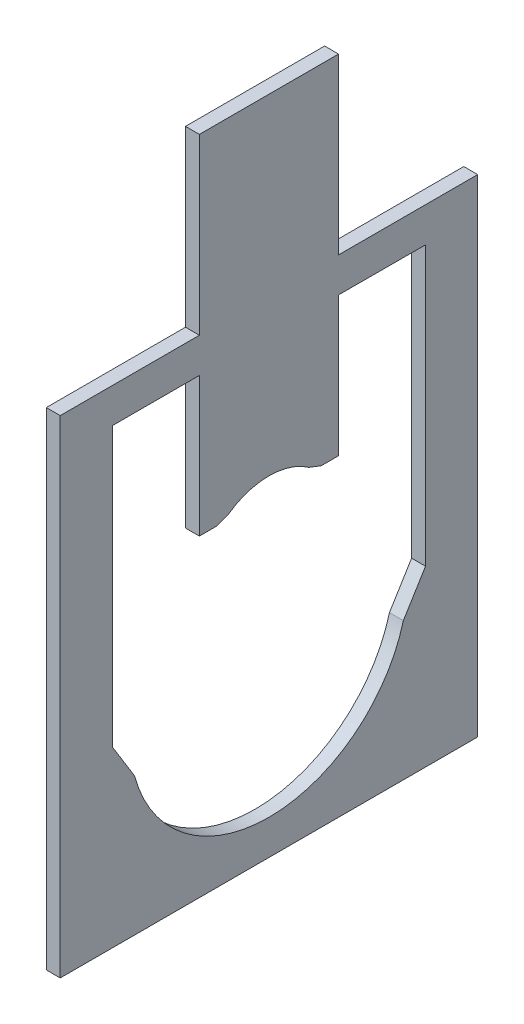
ISO-10303-21;
HEADER;
FILE_DESCRIPTION(('STEP AP214'),'2;1');
FILE_NAME('part.step','',(''),(''),'','','');
FILE_SCHEMA(('AUTOMOTIVE_DESIGN { 1 0 10303 214 1 1 1 1 }'));
ENDSEC;
DATA;
#1=APPLICATION_CONTEXT('core data for automotive mechanical design processes');
#2=APPLICATION_PROTOCOL_DEFINITION('international standard','automotive_design',2000,#1);
#3=PRODUCT_CONTEXT('',#1,'mechanical');
#4=PRODUCT('Part','Part','',(#3));
#5=PRODUCT_RELATED_PRODUCT_CATEGORY('part','',(#4));
#6=PRODUCT_DEFINITION_FORMATION('','',#4);
#7=PRODUCT_DEFINITION_CONTEXT('part definition',#1,'design');
#8=PRODUCT_DEFINITION('design','',#6,#7);
#9=PRODUCT_DEFINITION_SHAPE('','',#8);
#10=(LENGTH_UNIT() NAMED_UNIT(*) SI_UNIT(.MILLI.,.METRE.));
#11=(NAMED_UNIT(*) PLANE_ANGLE_UNIT() SI_UNIT($,.RADIAN.));
#12=(NAMED_UNIT(*) SI_UNIT($,.STERADIAN.) SOLID_ANGLE_UNIT());
#13=UNCERTAINTY_MEASURE_WITH_UNIT(LENGTH_MEASURE(1.E-05),#10,'distance_accuracy_value','');
#14=(GEOMETRIC_REPRESENTATION_CONTEXT(3) GLOBAL_UNCERTAINTY_ASSIGNED_CONTEXT((#13)) GLOBAL_UNIT_ASSIGNED_CONTEXT((#10,
#11,#12)) REPRESENTATION_CONTEXT('',''));
#15=CARTESIAN_POINT('',(0.,0.,0.));
#16=DIRECTION('',(0.,0.,1.));
#17=DIRECTION('',(1.,0.,0.));
#18=AXIS2_PLACEMENT_3D('',#15,#16,#17);
#19=CARTESIAN_POINT('',(2.,0.,20.));
#20=DIRECTION('',(0.,0.,-1.));
#21=DIRECTION('',(-1.,0.,0.));
#22=AXIS2_PLACEMENT_3D('',#19,#20,#21);
#23=PLANE('',#22);
#24=DIRECTION('',(0.,-1.,0.));
#25=VECTOR('',#24,1.);
#26=CARTESIAN_POINT('',(0.,0.,20.));
#27=LINE('',#26,#25);
#28=CARTESIAN_POINT('',(0.,25.,20.));
#29=VERTEX_POINT('',#28);
#30=CARTESIAN_POINT('',(0.,0.,20.));
#31=VERTEX_POINT('',#30);
#32=EDGE_CURVE('E307',#29,#31,#27,.T.);
#33=ORIENTED_EDGE('',*,*,#32,.T.);
#34=DIRECTION('',(-1.,0.,0.));
#35=VECTOR('',#34,1.);
#36=CARTESIAN_POINT('',(2.,0.,20.));
#37=LINE('',#36,#35);
#38=CARTESIAN_POINT('',(2.,0.,20.));
#39=VERTEX_POINT('',#38);
#40=EDGE_CURVE('E11',#39,#31,#37,.T.);
#41=ORIENTED_EDGE('',*,*,#40,.F.);
#42=DIRECTION('',(0.,-1.,0.));
#43=VECTOR('',#42,1.);
#44=CARTESIAN_POINT('',(2.,0.,20.));
#45=LINE('',#44,#43);
#46=CARTESIAN_POINT('',(2.,25.,20.));
#47=VERTEX_POINT('',#46);
#48=EDGE_CURVE('E243',#47,#39,#45,.T.);
#49=ORIENTED_EDGE('',*,*,#48,.F.);
#50=DIRECTION('',(-1.,0.,0.));
#51=VECTOR('',#50,1.);
#52=CARTESIAN_POINT('',(2.,25.,20.));
#53=LINE('',#52,#51);
#54=EDGE_CURVE('E54',#47,#29,#53,.T.);
#55=ORIENTED_EDGE('',*,*,#54,.T.);
#56=EDGE_LOOP('',(#33,#41,#49,#55));
#57=FACE_BOUND('',#56,.T.);
#58=ADVANCED_FACE('F35',(#57),#23,.F.);
#59=CARTESIAN_POINT('',(2.,0.,0.));
#60=DIRECTION('',(0.,1.,0.));
#61=DIRECTION('',(0.,0.,1.));
#62=AXIS2_PLACEMENT_3D('',#59,#60,#61);
#63=PLANE('',#62);
#64=DIRECTION('',(0.,0.,-1.));
#65=VECTOR('',#64,1.);
#66=CARTESIAN_POINT('',(0.,0.,0.));
#67=LINE('',#66,#65);
#68=CARTESIAN_POINT('',(0.,0.,40.));
#69=VERTEX_POINT('',#68);
#70=EDGE_CURVE('E338',#69,#31,#67,.T.);
#71=ORIENTED_EDGE('',*,*,#70,.F.);
#72=DIRECTION('',(-1.,0.,0.));
#73=VECTOR('',#72,1.);
#74=CARTESIAN_POINT('',(2.,0.,40.));
#75=LINE('',#74,#73);
#76=CARTESIAN_POINT('',(2.,0.,40.));
#77=VERTEX_POINT('',#76);
#78=EDGE_CURVE('E45',#77,#69,#75,.T.);
#79=ORIENTED_EDGE('',*,*,#78,.F.);
#80=DIRECTION('',(0.,0.,-1.));
#81=VECTOR('',#80,1.);
#82=CARTESIAN_POINT('',(2.,0.,0.));
#83=LINE('',#82,#81);
#84=EDGE_CURVE('E419',#77,#39,#83,.T.);
#85=ORIENTED_EDGE('',*,*,#84,.T.);
#86=ORIENTED_EDGE('',*,*,#40,.T.);
#87=EDGE_LOOP('',(#71,#79,#85,#86));
#88=FACE_BOUND('',#87,.T.);
#89=ADVANCED_FACE('F359',(#88),#63,.T.);
#90=CARTESIAN_POINT('',(2.,0.,40.));
#91=DIRECTION('',(0.,0.,1.));
#92=DIRECTION('',(1.,0.,0.));
#93=AXIS2_PLACEMENT_3D('',#90,#91,#92);
#94=PLANE('',#93);
#95=DIRECTION('',(0.,1.,0.));
#96=VECTOR('',#95,1.);
#97=CARTESIAN_POINT('',(0.,0.,40.));
#98=LINE('',#97,#96);
#99=CARTESIAN_POINT('',(0.,-70.,40.));
#100=VERTEX_POINT('',#99);
#101=EDGE_CURVE('E341',#100,#69,#98,.T.);
#102=ORIENTED_EDGE('',*,*,#101,.F.);
#103=DIRECTION('',(-1.,0.,0.));
#104=VECTOR('',#103,1.);
#105=CARTESIAN_POINT('',(2.,-70.,40.));
#106=LINE('',#105,#104);
#107=CARTESIAN_POINT('',(2.,-70.,40.));
#108=VERTEX_POINT('',#107);
#109=EDGE_CURVE('E261',#108,#100,#106,.T.);
#110=ORIENTED_EDGE('',*,*,#109,.F.);
#111=DIRECTION('',(0.,1.,0.));
#112=VECTOR('',#111,1.);
#113=CARTESIAN_POINT('',(2.,0.,40.));
#114=LINE('',#113,#112);
#115=EDGE_CURVE('E422',#108,#77,#114,.T.);
#116=ORIENTED_EDGE('',*,*,#115,.T.);
#117=ORIENTED_EDGE('',*,*,#78,.T.);
#118=EDGE_LOOP('',(#102,#110,#116,#117));
#119=FACE_BOUND('',#118,.T.);
#120=ADVANCED_FACE('F364',(#119),#94,.T.);
#121=CARTESIAN_POINT('',(2.,-70.,0.));
#122=DIRECTION('',(0.,-1.,0.));
#123=DIRECTION('',(0.,0.,-1.));
#124=AXIS2_PLACEMENT_3D('',#121,#122,#123);
#125=PLANE('',#124);
#126=DIRECTION('',(0.,0.,1.));
#127=VECTOR('',#126,1.);
#128=CARTESIAN_POINT('',(0.,-70.,0.));
#129=LINE('',#128,#127);
#130=CARTESIAN_POINT('',(0.,-70.,-20.));
#131=VERTEX_POINT('',#130);
#132=EDGE_CURVE('E344',#131,#100,#129,.T.);
#133=ORIENTED_EDGE('',*,*,#132,.F.);
#134=DIRECTION('',(-1.,0.,0.));
#135=VECTOR('',#134,1.);
#136=CARTESIAN_POINT('',(2.,-70.,-20.));
#137=LINE('',#136,#135);
#138=CARTESIAN_POINT('',(2.,-70.,-20.));
#139=VERTEX_POINT('',#138);
#140=EDGE_CURVE('E259',#139,#131,#137,.T.);
#141=ORIENTED_EDGE('',*,*,#140,.F.);
#142=DIRECTION('',(0.,0.,1.));
#143=VECTOR('',#142,1.);
#144=CARTESIAN_POINT('',(2.,-70.,0.));
#145=LINE('',#144,#143);
#146=EDGE_CURVE('E425',#139,#108,#145,.T.);
#147=ORIENTED_EDGE('',*,*,#146,.T.);
#148=ORIENTED_EDGE('',*,*,#109,.T.);
#149=EDGE_LOOP('',(#133,#141,#147,#148));
#150=FACE_BOUND('',#149,.T.);
#151=ADVANCED_FACE('F431',(#150),#125,.T.);
#152=CARTESIAN_POINT('',(2.,0.,-20.));
#153=DIRECTION('',(0.,0.,-1.));
#154=DIRECTION('',(0.,1.,0.));
#155=AXIS2_PLACEMENT_3D('',#152,#153,#154);
#156=PLANE('',#155);
#157=DIRECTION('',(0.,-1.,0.));
#158=VECTOR('',#157,1.);
#159=CARTESIAN_POINT('',(0.,0.,-20.));
#160=LINE('',#159,#158);
#161=CARTESIAN_POINT('',(0.,0.,-20.));
#162=VERTEX_POINT('',#161);
#163=EDGE_CURVE('E346',#162,#131,#160,.T.);
#164=ORIENTED_EDGE('',*,*,#163,.F.);
#165=DIRECTION('',(-1.,0.,0.));
#166=VECTOR('',#165,1.);
#167=CARTESIAN_POINT('',(2.,0.,-20.));
#168=LINE('',#167,#166);
#169=CARTESIAN_POINT('',(2.,0.,-20.));
#170=VERTEX_POINT('',#169);
#171=EDGE_CURVE('E201',#170,#162,#168,.T.);
#172=ORIENTED_EDGE('',*,*,#171,.F.);
#173=DIRECTION('',(0.,-1.,0.));
#174=VECTOR('',#173,1.);
#175=CARTESIAN_POINT('',(2.,0.,-20.));
#176=LINE('',#175,#174);
#177=EDGE_CURVE('E211',#170,#139,#176,.T.);
#178=ORIENTED_EDGE('',*,*,#177,.T.);
#179=ORIENTED_EDGE('',*,*,#140,.T.);
#180=EDGE_LOOP('',(#164,#172,#178,#179));
#181=FACE_BOUND('',#180,.T.);
#182=ADVANCED_FACE('F383',(#181),#156,.T.);
#183=CARTESIAN_POINT('',(2.,0.,0.));
#184=DIRECTION('',(0.,1.,0.));
#185=DIRECTION('',(0.,0.,1.));
#186=AXIS2_PLACEMENT_3D('',#183,#184,#185);
#187=PLANE('',#186);
#188=DIRECTION('',(0.,0.,-1.));
#189=VECTOR('',#188,1.);
#190=CARTESIAN_POINT('',(0.,0.,0.));
#191=LINE('',#190,#189);
#192=CARTESIAN_POINT('',(0.,0.,0.));
#193=VERTEX_POINT('',#192);
#194=EDGE_CURVE('E197',#193,#162,#191,.T.);
#195=ORIENTED_EDGE('',*,*,#194,.F.);
#196=DIRECTION('',(-1.,0.,0.));
#197=VECTOR('',#196,1.);
#198=CARTESIAN_POINT('',(2.,0.,0.));
#199=LINE('',#198,#197);
#200=CARTESIAN_POINT('',(2.,0.,0.));
#201=VERTEX_POINT('',#200);
#202=EDGE_CURVE('E192',#201,#193,#199,.T.);
#203=ORIENTED_EDGE('',*,*,#202,.F.);
#204=DIRECTION('',(0.,0.,-1.));
#205=VECTOR('',#204,1.);
#206=CARTESIAN_POINT('',(2.,0.,0.));
#207=LINE('',#206,#205);
#208=EDGE_CURVE('E195',#201,#170,#207,.T.);
#209=ORIENTED_EDGE('',*,*,#208,.T.);
#210=ORIENTED_EDGE('',*,*,#171,.T.);
#211=EDGE_LOOP('',(#195,#203,#209,#210));
#212=FACE_BOUND('',#211,.T.);
#213=ADVANCED_FACE('F194',(#212),#187,.T.);
#214=CARTESIAN_POINT('',(2.,0.,0.));
#215=DIRECTION('',(0.,0.,-1.));
#216=DIRECTION('',(-1.,0.,0.));
#217=AXIS2_PLACEMENT_3D('',#214,#215,#216);
#218=PLANE('',#217);
#219=DIRECTION('',(0.,-1.,0.));
#220=VECTOR('',#219,1.);
#221=CARTESIAN_POINT('',(0.,0.,0.));
#222=LINE('',#221,#220);
#223=CARTESIAN_POINT('',(0.,25.,0.));
#224=VERTEX_POINT('',#223);
#225=EDGE_CURVE('E248',#224,#193,#222,.T.);
#226=ORIENTED_EDGE('',*,*,#225,.F.);
#227=DIRECTION('',(-1.,0.,0.));
#228=VECTOR('',#227,1.);
#229=CARTESIAN_POINT('',(2.,25.,0.));
#230=LINE('',#229,#228);
#231=CARTESIAN_POINT('',(2.,25.,0.));
#232=VERTEX_POINT('',#231);
#233=EDGE_CURVE('E121',#232,#224,#230,.T.);
#234=ORIENTED_EDGE('',*,*,#233,.F.);
#235=DIRECTION('',(0.,-1.,0.));
#236=VECTOR('',#235,1.);
#237=CARTESIAN_POINT('',(2.,0.,0.));
#238=LINE('',#237,#236);
#239=EDGE_CURVE('E208',#232,#201,#238,.T.);
#240=ORIENTED_EDGE('',*,*,#239,.T.);
#241=ORIENTED_EDGE('',*,*,#202,.T.);
#242=EDGE_LOOP('',(#226,#234,#240,#241));
#243=FACE_BOUND('',#242,.T.);
#244=ADVANCED_FACE('F213',(#243),#218,.T.);
#245=CARTESIAN_POINT('',(2.,-5.,0.));
#246=DIRECTION('',(0.,1.,0.));
#247=DIRECTION('',(0.,0.,1.));
#248=AXIS2_PLACEMENT_3D('',#245,#246,#247);
#249=PLANE('',#248);
#250=DIRECTION('',(0.,0.,-1.));
#251=VECTOR('',#250,1.);
#252=CARTESIAN_POINT('',(0.,-5.,0.));
#253=LINE('',#252,#251);
#254=CARTESIAN_POINT('',(0.,-5.,32.5));
#255=VERTEX_POINT('',#254);
#256=CARTESIAN_POINT('',(0.,-5.,20.));
#257=VERTEX_POINT('',#256);
#258=EDGE_CURVE('E300',#255,#257,#253,.T.);
#259=ORIENTED_EDGE('',*,*,#258,.T.);
#260=DIRECTION('',(-1.,0.,0.));
#261=VECTOR('',#260,1.);
#262=CARTESIAN_POINT('',(2.,-5.,20.));
#263=LINE('',#262,#261);
#264=CARTESIAN_POINT('',(2.,-5.,20.));
#265=VERTEX_POINT('',#264);
#266=EDGE_CURVE('E39',#265,#257,#263,.T.);
#267=ORIENTED_EDGE('',*,*,#266,.F.);
#268=DIRECTION('',(0.,0.,-1.));
#269=VECTOR('',#268,1.);
#270=CARTESIAN_POINT('',(2.,-5.,0.));
#271=LINE('',#270,#269);
#272=CARTESIAN_POINT('',(2.,-5.,32.5));
#273=VERTEX_POINT('',#272);
#274=EDGE_CURVE('E242',#273,#265,#271,.T.);
#275=ORIENTED_EDGE('',*,*,#274,.F.);
#276=DIRECTION('',(-1.,0.,0.));
#277=VECTOR('',#276,1.);
#278=CARTESIAN_POINT('',(2.,-5.,32.5));
#279=LINE('',#278,#277);
#280=EDGE_CURVE('E217',#273,#255,#279,.T.);
#281=ORIENTED_EDGE('',*,*,#280,.T.);
#282=EDGE_LOOP('',(#259,#267,#275,#281));
#283=FACE_BOUND('',#282,.T.);
#284=ADVANCED_FACE('F37',(#283),#249,.F.);
#285=CARTESIAN_POINT('',(0.,-25.,20.));
#286=VERTEX_POINT('',#285);
#287=EDGE_CURVE('E297',#257,#286,#27,.T.);
#288=ORIENTED_EDGE('',*,*,#287,.T.);
#289=DIRECTION('',(-1.,0.,0.));
#290=VECTOR('',#289,1.);
#291=CARTESIAN_POINT('',(2.,-25.,20.));
#292=LINE('',#291,#290);
#293=CARTESIAN_POINT('',(2.,-25.,20.));
#294=VERTEX_POINT('',#293);
#295=EDGE_CURVE('E290',#294,#286,#292,.T.);
#296=ORIENTED_EDGE('',*,*,#295,.F.);
#297=EDGE_CURVE('E134',#265,#294,#45,.T.);
#298=ORIENTED_EDGE('',*,*,#297,.F.);
#299=ORIENTED_EDGE('',*,*,#266,.T.);
#300=EDGE_LOOP('',(#288,#296,#298,#299));
#301=FACE_BOUND('',#300,.T.);
#302=ADVANCED_FACE('F296',(#301),#23,.F.);
#303=CARTESIAN_POINT('',(2.,-25.,0.));
#304=DIRECTION('',(0.,1.,0.));
#305=DIRECTION('',(0.,0.,1.));
#306=AXIS2_PLACEMENT_3D('',#303,#304,#305);
#307=PLANE('',#306);
#308=DIRECTION('',(0.,0.,-1.));
#309=VECTOR('',#308,1.);
#310=CARTESIAN_POINT('',(0.,-25.,0.));
#311=LINE('',#310,#309);
#312=CARTESIAN_POINT('',(0.,-25.,17.5));
#313=VERTEX_POINT('',#312);
#314=EDGE_CURVE('E305',#286,#313,#311,.T.);
#315=ORIENTED_EDGE('',*,*,#314,.T.);
#316=DIRECTION('',(-1.,0.,0.));
#317=VECTOR('',#316,1.);
#318=CARTESIAN_POINT('',(2.,-25.,17.5));
#319=LINE('',#318,#317);
#320=CARTESIAN_POINT('',(2.,-25.,17.5));
#321=VERTEX_POINT('',#320);
#322=EDGE_CURVE('E288',#321,#313,#319,.T.);
#323=ORIENTED_EDGE('',*,*,#322,.F.);
#324=DIRECTION('',(0.,0.,-1.));
#325=VECTOR('',#324,1.);
#326=CARTESIAN_POINT('',(2.,-25.,0.));
#327=LINE('',#326,#325);
#328=EDGE_CURVE('E239',#294,#321,#327,.T.);
#329=ORIENTED_EDGE('',*,*,#328,.F.);
#330=ORIENTED_EDGE('',*,*,#295,.T.);
#331=EDGE_LOOP('',(#315,#323,#329,#330));
#332=FACE_BOUND('',#331,.T.);
#333=ADVANCED_FACE('F369',(#332),#307,.F.);
#334=CARTESIAN_POINT('',(2.,-15.789820492922,-6.14931478707496));
#335=DIRECTION('',(0.,0.931828552999182,0.362898812088784));
#336=DIRECTION('',(0.,-0.362898812088784,0.931828552999182));
#337=AXIS2_PLACEMENT_3D('',#334,#335,#336);
#338=PLANE('',#337);
#339=DIRECTION('',(0.,0.362898812088784,-0.931828552999182));
#340=VECTOR('',#339,1.);
#341=CARTESIAN_POINT('',(0.,-15.789820492922,-6.14931478707496));
#342=LINE('',#341,#340);
#343=CARTESIAN_POINT('',(0.,-24.3184659140232,15.75));
#344=VERTEX_POINT('',#343);
#345=EDGE_CURVE('E310',#313,#344,#342,.T.);
#346=ORIENTED_EDGE('',*,*,#345,.T.);
#347=DIRECTION('',(-1.,0.,0.));
#348=VECTOR('',#347,1.);
#349=CARTESIAN_POINT('',(2.,-24.3184659140232,15.75));
#350=LINE('',#349,#348);
#351=CARTESIAN_POINT('',(2.,-24.3184659140232,15.75));
#352=VERTEX_POINT('',#351);
#353=EDGE_CURVE('E286',#352,#344,#350,.T.);
#354=ORIENTED_EDGE('',*,*,#353,.F.);
#355=DIRECTION('',(0.,0.362898812088784,-0.931828552999182));
#356=VECTOR('',#355,1.);
#357=CARTESIAN_POINT('',(2.,-15.789820492922,-6.14931478707496));
#358=LINE('',#357,#356);
#359=EDGE_CURVE('E237',#321,#352,#358,.T.);
#360=ORIENTED_EDGE('',*,*,#359,.F.);
#361=ORIENTED_EDGE('',*,*,#322,.T.);
#362=EDGE_LOOP('',(#346,#354,#360,#361));
#363=FACE_BOUND('',#362,.T.);
#364=ADVANCED_FACE('F374',(#363),#338,.F.);
#365=CARTESIAN_POINT('',(2.,-32.5,10.));
#366=DIRECTION('',(-1.,0.,0.));
#367=DIRECTION('',(0.,0.,1.));
#368=AXIS2_PLACEMENT_3D('',#365,#366,#367);
#369=CYLINDRICAL_SURFACE('',#368,10.);
#370=CARTESIAN_POINT('',(0.,-32.5,10.));
#371=DIRECTION('',(1.,0.,0.));
#372=DIRECTION('',(0.,0.,-1.));
#373=AXIS2_PLACEMENT_3D('',#370,#371,#372);
#374=CIRCLE('',#373,10.);
#375=CARTESIAN_POINT('',(0.,-24.3184659140232,4.25));
#376=VERTEX_POINT('',#375);
#377=EDGE_CURVE('E313',#376,#344,#374,.T.);
#378=ORIENTED_EDGE('',*,*,#377,.F.);
#379=DIRECTION('',(-1.,0.,0.));
#380=VECTOR('',#379,1.);
#381=CARTESIAN_POINT('',(2.,-24.3184659140232,4.25));
#382=LINE('',#381,#380);
#383=CARTESIAN_POINT('',(2.,-24.3184659140232,4.25));
#384=VERTEX_POINT('',#383);
#385=EDGE_CURVE('E284',#384,#376,#382,.T.);
#386=ORIENTED_EDGE('',*,*,#385,.F.);
#387=CARTESIAN_POINT('',(2.,-32.5,10.));
#388=DIRECTION('',(1.,0.,0.));
#389=DIRECTION('',(0.,0.,-1.));
#390=AXIS2_PLACEMENT_3D('',#387,#388,#389);
#391=CIRCLE('',#390,10.);
#392=EDGE_CURVE('E232',#384,#352,#391,.T.);
#393=ORIENTED_EDGE('',*,*,#392,.T.);
#394=ORIENTED_EDGE('',*,*,#353,.T.);
#395=EDGE_LOOP('',(#378,#386,#393,#394));
#396=FACE_BOUND('',#395,.T.);
#397=ADVANCED_FACE('F463',(#396),#369,.F.);
#398=CARTESIAN_POINT('',(2.,-22.5530099919983,8.78322574338398));
#399=DIRECTION('',(0.,0.931828552999182,-0.362898812088784));
#400=DIRECTION('',(0.,0.362898812088784,0.931828552999182));
#401=AXIS2_PLACEMENT_3D('',#398,#399,#400);
#402=PLANE('',#401);
#403=DIRECTION('',(0.,-0.362898812088784,-0.931828552999182));
#404=VECTOR('',#403,1.);
#405=CARTESIAN_POINT('',(0.,-22.5530099919983,8.78322574338398));
#406=LINE('',#405,#404);
#407=CARTESIAN_POINT('',(0.,-25.,2.5));
#408=VERTEX_POINT('',#407);
#409=EDGE_CURVE('E316',#376,#408,#406,.T.);
#410=ORIENTED_EDGE('',*,*,#409,.T.);
#411=DIRECTION('',(-1.,0.,0.));
#412=VECTOR('',#411,1.);
#413=CARTESIAN_POINT('',(2.,-25.,2.5));
#414=LINE('',#413,#412);
#415=CARTESIAN_POINT('',(2.,-25.,2.5));
#416=VERTEX_POINT('',#415);
#417=EDGE_CURVE('E281',#416,#408,#414,.T.);
#418=ORIENTED_EDGE('',*,*,#417,.F.);
#419=DIRECTION('',(0.,-0.362898812088784,-0.931828552999182));
#420=VECTOR('',#419,1.);
#421=CARTESIAN_POINT('',(2.,-22.5530099919983,8.78322574338398));
#422=LINE('',#421,#420);
#423=EDGE_CURVE('E228',#384,#416,#422,.T.);
#424=ORIENTED_EDGE('',*,*,#423,.F.);
#425=ORIENTED_EDGE('',*,*,#385,.T.);
#426=EDGE_LOOP('',(#410,#418,#424,#425));
#427=FACE_BOUND('',#426,.T.);
#428=ADVANCED_FACE('F395',(#427),#402,.F.);
#429=CARTESIAN_POINT('',(2.,-25.,0.));
#430=DIRECTION('',(0.,1.,0.));
#431=DIRECTION('',(0.,0.,1.));
#432=AXIS2_PLACEMENT_3D('',#429,#430,#431);
#433=PLANE('',#432);
#434=DIRECTION('',(0.,0.,-1.));
#435=VECTOR('',#434,1.);
#436=CARTESIAN_POINT('',(0.,-25.,0.));
#437=LINE('',#436,#435);
#438=CARTESIAN_POINT('',(0.,-25.,0.));
#439=VERTEX_POINT('',#438);
#440=EDGE_CURVE('E318',#408,#439,#437,.T.);
#441=ORIENTED_EDGE('',*,*,#440,.T.);
#442=DIRECTION('',(-1.,0.,0.));
#443=VECTOR('',#442,1.);
#444=CARTESIAN_POINT('',(2.,-25.,0.));
#445=LINE('',#444,#443);
#446=CARTESIAN_POINT('',(2.,-25.,0.));
#447=VERTEX_POINT('',#446);
#448=EDGE_CURVE('E279',#447,#439,#445,.T.);
#449=ORIENTED_EDGE('',*,*,#448,.F.);
#450=DIRECTION('',(0.,0.,-1.));
#451=VECTOR('',#450,1.);
#452=CARTESIAN_POINT('',(2.,-25.,0.));
#453=LINE('',#452,#451);
#454=EDGE_CURVE('E223',#416,#447,#453,.T.);
#455=ORIENTED_EDGE('',*,*,#454,.F.);
#456=ORIENTED_EDGE('',*,*,#417,.T.);
#457=EDGE_LOOP('',(#441,#449,#455,#456));
#458=FACE_BOUND('',#457,.T.);
#459=ADVANCED_FACE('F387',(#458),#433,.F.);
#460=CARTESIAN_POINT('',(0.,-4.98159028910465,0.));
#461=VERTEX_POINT('',#460);
#462=EDGE_CURVE('E252',#461,#439,#222,.T.);
#463=ORIENTED_EDGE('',*,*,#462,.F.);
#464=DIRECTION('',(-1.,0.,0.));
#465=VECTOR('',#464,1.);
#466=CARTESIAN_POINT('',(2.,-4.98159028910465,0.));
#467=LINE('',#466,#465);
#468=CARTESIAN_POINT('',(2.,-4.98159028910465,0.));
#469=VERTEX_POINT('',#468);
#470=EDGE_CURVE('E277',#469,#461,#467,.T.);
#471=ORIENTED_EDGE('',*,*,#470,.F.);
#472=EDGE_CURVE('E216',#469,#447,#238,.T.);
#473=ORIENTED_EDGE('',*,*,#472,.T.);
#474=ORIENTED_EDGE('',*,*,#448,.T.);
#475=EDGE_LOOP('',(#463,#471,#473,#474));
#476=FACE_BOUND('',#475,.T.);
#477=ADVANCED_FACE('F379',(#476),#218,.T.);
#478=CARTESIAN_POINT('',(2.,-4.9815794837015,0.00733675504777144));
#479=DIRECTION('',(0.,-0.999998915465907,0.00147277527435113));
#480=DIRECTION('',(0.,-0.00147277527435113,-0.999998915465908));
#481=AXIS2_PLACEMENT_3D('',#478,#479,#480);
#482=PLANE('',#481);
#483=DIRECTION('',(0.,0.00147277527435113,0.999998915465908));
#484=VECTOR('',#483,1.);
#485=CARTESIAN_POINT('',(0.,-4.9815794837015,0.00733675504777144));
#486=LINE('',#485,#484);
#487=CARTESIAN_POINT('',(0.,-5.,-12.5));
#488=VERTEX_POINT('',#487);
#489=EDGE_CURVE('E322',#488,#461,#486,.T.);
#490=ORIENTED_EDGE('',*,*,#489,.F.);
#491=DIRECTION('',(-1.,0.,0.));
#492=VECTOR('',#491,1.);
#493=CARTESIAN_POINT('',(2.,-5.,-12.5));
#494=LINE('',#493,#492);
#495=CARTESIAN_POINT('',(2.,-5.,-12.5));
#496=VERTEX_POINT('',#495);
#497=EDGE_CURVE('E275',#496,#488,#494,.T.);
#498=ORIENTED_EDGE('',*,*,#497,.F.);
#499=DIRECTION('',(0.,0.00147277527435113,0.999998915465908));
#500=VECTOR('',#499,1.);
#501=CARTESIAN_POINT('',(2.,-4.9815794837015,0.00733675504777144));
#502=LINE('',#501,#500);
#503=EDGE_CURVE('E222',#496,#469,#502,.T.);
#504=ORIENTED_EDGE('',*,*,#503,.T.);
#505=ORIENTED_EDGE('',*,*,#470,.T.);
#506=EDGE_LOOP('',(#490,#498,#504,#505));
#507=FACE_BOUND('',#506,.T.);
#508=ADVANCED_FACE('F386',(#507),#482,.T.);
#509=CARTESIAN_POINT('',(2.,0.,-12.5));
#510=DIRECTION('',(0.,0.,1.));
#511=DIRECTION('',(0.,-1.,0.));
#512=AXIS2_PLACEMENT_3D('',#509,#510,#511);
#513=PLANE('',#512);
#514=DIRECTION('',(0.,1.,0.));
#515=VECTOR('',#514,1.);
#516=CARTESIAN_POINT('',(0.,0.,-12.5));
#517=LINE('',#516,#515);
#518=CARTESIAN_POINT('',(0.,-45.,-12.5));
#519=VERTEX_POINT('',#518);
#520=EDGE_CURVE('E325',#519,#488,#517,.T.);
#521=ORIENTED_EDGE('',*,*,#520,.F.);
#522=DIRECTION('',(-1.,0.,0.));
#523=VECTOR('',#522,1.);
#524=CARTESIAN_POINT('',(2.,-45.,-12.5));
#525=LINE('',#524,#523);
#526=CARTESIAN_POINT('',(2.,-45.,-12.5));
#527=VERTEX_POINT('',#526);
#528=EDGE_CURVE('E273',#527,#519,#525,.T.);
#529=ORIENTED_EDGE('',*,*,#528,.F.);
#530=DIRECTION('',(0.,1.,0.));
#531=VECTOR('',#530,1.);
#532=CARTESIAN_POINT('',(2.,0.,-12.5));
#533=LINE('',#532,#531);
#534=EDGE_CURVE('E227',#527,#496,#533,.T.);
#535=ORIENTED_EDGE('',*,*,#534,.T.);
#536=ORIENTED_EDGE('',*,*,#497,.T.);
#537=EDGE_LOOP('',(#521,#529,#535,#536));
#538=FACE_BOUND('',#537,.T.);
#539=ADVANCED_FACE('F392',(#538),#513,.T.);
#540=CARTESIAN_POINT('',(2.,-17.9143528203392,-29.1472561662674));
#541=DIRECTION('',(0.,-0.523622022882797,-0.851950689390019));
#542=DIRECTION('',(0.,0.851950689390019,-0.523622022882797));
#543=AXIS2_PLACEMENT_3D('',#540,#541,#542);
#544=PLANE('',#543);
#545=DIRECTION('',(0.,-0.851950689390019,0.523622022882797));
#546=VECTOR('',#545,1.);
#547=CARTESIAN_POINT('',(0.,-17.9143528203392,-29.1472561662674));
#548=LINE('',#547,#546);
#549=CARTESIAN_POINT('',(0.,-50.1763809020504,-9.31851652578136));
#550=VERTEX_POINT('',#549);
#551=EDGE_CURVE('E328',#519,#550,#548,.T.);
#552=ORIENTED_EDGE('',*,*,#551,.T.);
#553=DIRECTION('',(-1.,0.,0.));
#554=VECTOR('',#553,1.);
#555=CARTESIAN_POINT('',(2.,-50.1763809020504,-9.31851652578136));
#556=LINE('',#555,#554);
#557=CARTESIAN_POINT('',(2.,-50.1763809020504,-9.31851652578136));
#558=VERTEX_POINT('',#557);
#559=EDGE_CURVE('E271',#558,#550,#556,.T.);
#560=ORIENTED_EDGE('',*,*,#559,.F.);
#561=DIRECTION('',(0.,-0.851950689390019,0.523622022882797));
#562=VECTOR('',#561,1.);
#563=CARTESIAN_POINT('',(2.,-17.9143528203392,-29.1472561662674));
#564=LINE('',#563,#562);
#565=EDGE_CURVE('E408',#527,#558,#564,.T.);
#566=ORIENTED_EDGE('',*,*,#565,.F.);
#567=ORIENTED_EDGE('',*,*,#528,.T.);
#568=EDGE_LOOP('',(#552,#560,#566,#567));
#569=FACE_BOUND('',#568,.T.);
#570=ADVANCED_FACE('F454',(#569),#544,.F.);
#571=CARTESIAN_POINT('',(2.,-45.,10.));
#572=DIRECTION('',(-1.,0.,0.));
#573=DIRECTION('',(0.,0.,1.));
#574=AXIS2_PLACEMENT_3D('',#571,#572,#573);
#575=CYLINDRICAL_SURFACE('',#574,20.);
#576=CARTESIAN_POINT('',(0.,-45.,10.));
#577=DIRECTION('',(1.,0.,0.));
#578=DIRECTION('',(0.,0.,-1.));
#579=AXIS2_PLACEMENT_3D('',#576,#577,#578);
#580=CIRCLE('',#579,20.);
#581=CARTESIAN_POINT('',(0.,-50.1763809020504,29.3185165257814));
#582=VERTEX_POINT('',#581);
#583=EDGE_CURVE('E331',#582,#550,#580,.T.);
#584=ORIENTED_EDGE('',*,*,#583,.F.);
#585=DIRECTION('',(-1.,0.,0.));
#586=VECTOR('',#585,1.);
#587=CARTESIAN_POINT('',(2.,-50.1763809020504,29.3185165257814));
#588=LINE('',#587,#586);
#589=CARTESIAN_POINT('',(2.,-50.1763809020504,29.3185165257814));
#590=VERTEX_POINT('',#589);
#591=EDGE_CURVE('E269',#590,#582,#588,.T.);
#592=ORIENTED_EDGE('',*,*,#591,.F.);
#593=CARTESIAN_POINT('',(2.,-45.,10.));
#594=DIRECTION('',(1.,0.,0.));
#595=DIRECTION('',(0.,0.,-1.));
#596=AXIS2_PLACEMENT_3D('',#593,#594,#595);
#597=CIRCLE('',#596,20.);
#598=EDGE_CURVE('E410',#590,#558,#597,.T.);
#599=ORIENTED_EDGE('',*,*,#598,.T.);
#600=ORIENTED_EDGE('',*,*,#559,.T.);
#601=EDGE_LOOP('',(#584,#592,#599,#600));
#602=FACE_BOUND('',#601,.T.);
#603=ADVANCED_FACE('F448',(#602),#575,.F.);
#604=CARTESIAN_POINT('',(2.,-26.836355687835,43.6636557093099));
#605=DIRECTION('',(0.,-0.523622022882796,0.851950689390019));
#606=DIRECTION('',(0.,-0.851950689390019,-0.523622022882796));
#607=AXIS2_PLACEMENT_3D('',#604,#605,#606);
#608=PLANE('',#607);
#609=DIRECTION('',(0.,0.851950689390019,0.523622022882796));
#610=VECTOR('',#609,1.);
#611=CARTESIAN_POINT('',(0.,-26.836355687835,43.6636557093099));
#612=LINE('',#611,#610);
#613=CARTESIAN_POINT('',(0.,-45.,32.5));
#614=VERTEX_POINT('',#613);
#615=EDGE_CURVE('E334',#582,#614,#612,.T.);
#616=ORIENTED_EDGE('',*,*,#615,.T.);
#617=DIRECTION('',(-1.,0.,0.));
#618=VECTOR('',#617,1.);
#619=CARTESIAN_POINT('',(2.,-45.,32.5));
#620=LINE('',#619,#618);
#621=CARTESIAN_POINT('',(2.,-45.,32.5));
#622=VERTEX_POINT('',#621);
#623=EDGE_CURVE('E266',#622,#614,#620,.T.);
#624=ORIENTED_EDGE('',*,*,#623,.F.);
#625=DIRECTION('',(0.,0.851950689390019,0.523622022882796));
#626=VECTOR('',#625,1.);
#627=CARTESIAN_POINT('',(2.,-26.836355687835,43.6636557093099));
#628=LINE('',#627,#626);
#629=EDGE_CURVE('E415',#590,#622,#628,.T.);
#630=ORIENTED_EDGE('',*,*,#629,.F.);
#631=ORIENTED_EDGE('',*,*,#591,.T.);
#632=EDGE_LOOP('',(#616,#624,#630,#631));
#633=FACE_BOUND('',#632,.T.);
#634=ADVANCED_FACE('F443',(#633),#608,.F.);
#635=CARTESIAN_POINT('',(2.,0.,32.5));
#636=DIRECTION('',(0.,0.,1.));
#637=DIRECTION('',(1.,0.,0.));
#638=AXIS2_PLACEMENT_3D('',#635,#636,#637);
#639=PLANE('',#638);
#640=DIRECTION('',(0.,1.,0.));
#641=VECTOR('',#640,1.);
#642=CARTESIAN_POINT('',(0.,0.,32.5));
#643=LINE('',#642,#641);
#644=EDGE_CURVE('E336',#614,#255,#643,.T.);
#645=ORIENTED_EDGE('',*,*,#644,.T.);
#646=ORIENTED_EDGE('',*,*,#280,.F.);
#647=DIRECTION('',(0.,1.,0.));
#648=VECTOR('',#647,1.);
#649=CARTESIAN_POINT('',(2.,0.,32.5));
#650=LINE('',#649,#648);
#651=EDGE_CURVE('E417',#622,#273,#650,.T.);
#652=ORIENTED_EDGE('',*,*,#651,.F.);
#653=ORIENTED_EDGE('',*,*,#623,.T.);
#654=EDGE_LOOP('',(#645,#646,#652,#653));
#655=FACE_BOUND('',#654,.T.);
#656=ADVANCED_FACE('F439',(#655),#639,.F.);
#657=CARTESIAN_POINT('',(2.,25.,0.));
#658=DIRECTION('',(0.,1.,0.));
#659=DIRECTION('',(0.,0.,1.));
#660=AXIS2_PLACEMENT_3D('',#657,#658,#659);
#661=PLANE('',#660);
#662=DIRECTION('',(0.,0.,-1.));
#663=VECTOR('',#662,1.);
#664=CARTESIAN_POINT('',(0.,25.,0.));
#665=LINE('',#664,#663);
#666=EDGE_CURVE('E244',#29,#224,#665,.T.);
#667=ORIENTED_EDGE('',*,*,#666,.F.);
#668=ORIENTED_EDGE('',*,*,#54,.F.);
#669=DIRECTION('',(0.,0.,-1.));
#670=VECTOR('',#669,1.);
#671=CARTESIAN_POINT('',(2.,25.,0.));
#672=LINE('',#671,#670);
#673=EDGE_CURVE('E214',#47,#232,#672,.T.);
#674=ORIENTED_EDGE('',*,*,#673,.T.);
#675=ORIENTED_EDGE('',*,*,#233,.T.);
#676=EDGE_LOOP('',(#667,#668,#674,#675));
#677=FACE_BOUND('',#676,.T.);
#678=ADVANCED_FACE('F355',(#677),#661,.T.);
#679=CARTESIAN_POINT('',(2.,0.,0.));
#680=DIRECTION('',(1.,0.,0.));
#681=DIRECTION('',(0.,0.,-1.));
#682=AXIS2_PLACEMENT_3D('',#679,#680,#681);
#683=PLANE('',#682);
#684=ORIENTED_EDGE('',*,*,#274,.T.);
#685=ORIENTED_EDGE('',*,*,#297,.T.);
#686=ORIENTED_EDGE('',*,*,#328,.T.);
#687=ORIENTED_EDGE('',*,*,#359,.T.);
#688=ORIENTED_EDGE('',*,*,#392,.F.);
#689=ORIENTED_EDGE('',*,*,#423,.T.);
#690=ORIENTED_EDGE('',*,*,#454,.T.);
#691=ORIENTED_EDGE('',*,*,#472,.F.);
#692=ORIENTED_EDGE('',*,*,#503,.F.);
#693=ORIENTED_EDGE('',*,*,#534,.F.);
#694=ORIENTED_EDGE('',*,*,#565,.T.);
#695=ORIENTED_EDGE('',*,*,#598,.F.);
#696=ORIENTED_EDGE('',*,*,#629,.T.);
#697=ORIENTED_EDGE('',*,*,#651,.T.);
#698=EDGE_LOOP('',(#684,#685,#686,#687,#688,#689,#690,#691,#692,#693,#694,#695,#696,#697));
#699=FACE_BOUND('',#698,.T.);
#700=ORIENTED_EDGE('',*,*,#48,.T.);
#701=ORIENTED_EDGE('',*,*,#84,.F.);
#702=ORIENTED_EDGE('',*,*,#115,.F.);
#703=ORIENTED_EDGE('',*,*,#146,.F.);
#704=ORIENTED_EDGE('',*,*,#177,.F.);
#705=ORIENTED_EDGE('',*,*,#208,.F.);
#706=ORIENTED_EDGE('',*,*,#239,.F.);
#707=ORIENTED_EDGE('',*,*,#673,.F.);
#708=EDGE_LOOP('',(#700,#701,#702,#703,#704,#705,#706,#707));
#709=FACE_BOUND('',#708,.T.);
#710=ADVANCED_FACE('F206',(#699,#709),#683,.T.);
#711=CARTESIAN_POINT('',(0.,0.,0.));
#712=DIRECTION('',(1.,0.,0.));
#713=DIRECTION('',(0.,0.,-1.));
#714=AXIS2_PLACEMENT_3D('',#711,#712,#713);
#715=PLANE('',#714);
#716=ORIENTED_EDGE('',*,*,#258,.F.);
#717=ORIENTED_EDGE('',*,*,#644,.F.);
#718=ORIENTED_EDGE('',*,*,#615,.F.);
#719=ORIENTED_EDGE('',*,*,#583,.T.);
#720=ORIENTED_EDGE('',*,*,#551,.F.);
#721=ORIENTED_EDGE('',*,*,#520,.T.);
#722=ORIENTED_EDGE('',*,*,#489,.T.);
#723=ORIENTED_EDGE('',*,*,#462,.T.);
#724=ORIENTED_EDGE('',*,*,#440,.F.);
#725=ORIENTED_EDGE('',*,*,#409,.F.);
#726=ORIENTED_EDGE('',*,*,#377,.T.);
#727=ORIENTED_EDGE('',*,*,#345,.F.);
#728=ORIENTED_EDGE('',*,*,#314,.F.);
#729=ORIENTED_EDGE('',*,*,#287,.F.);
#730=EDGE_LOOP('',(#716,#717,#718,#719,#720,#721,#722,#723,#724,#725,#726,#727,#728,#729));
#731=FACE_BOUND('',#730,.T.);
#732=ORIENTED_EDGE('',*,*,#32,.F.);
#733=ORIENTED_EDGE('',*,*,#666,.T.);
#734=ORIENTED_EDGE('',*,*,#225,.T.);
#735=ORIENTED_EDGE('',*,*,#194,.T.);
#736=ORIENTED_EDGE('',*,*,#163,.T.);
#737=ORIENTED_EDGE('',*,*,#132,.T.);
#738=ORIENTED_EDGE('',*,*,#101,.T.);
#739=ORIENTED_EDGE('',*,*,#70,.T.);
#740=EDGE_LOOP('',(#732,#733,#734,#735,#736,#737,#738,#739));
#741=FACE_BOUND('',#740,.T.);
#742=ADVANCED_FACE('F349',(#731,#741),#715,.F.);
#743=CLOSED_SHELL('',(#58,#89,#120,#151,#182,#213,#244,#284,#302,#333,#364,#397,#428,#459,#477,
#508,#539,#570,#603,#634,#656,#678,#710,#742));
#744=MANIFOLD_SOLID_BREP('B2',#743);
#745=ADVANCED_BREP_SHAPE_REPRESENTATION('',(#18,#744),#14);
#746=SHAPE_DEFINITION_REPRESENTATION(#9,#745);
ENDSEC;
END-ISO-10303-21;
